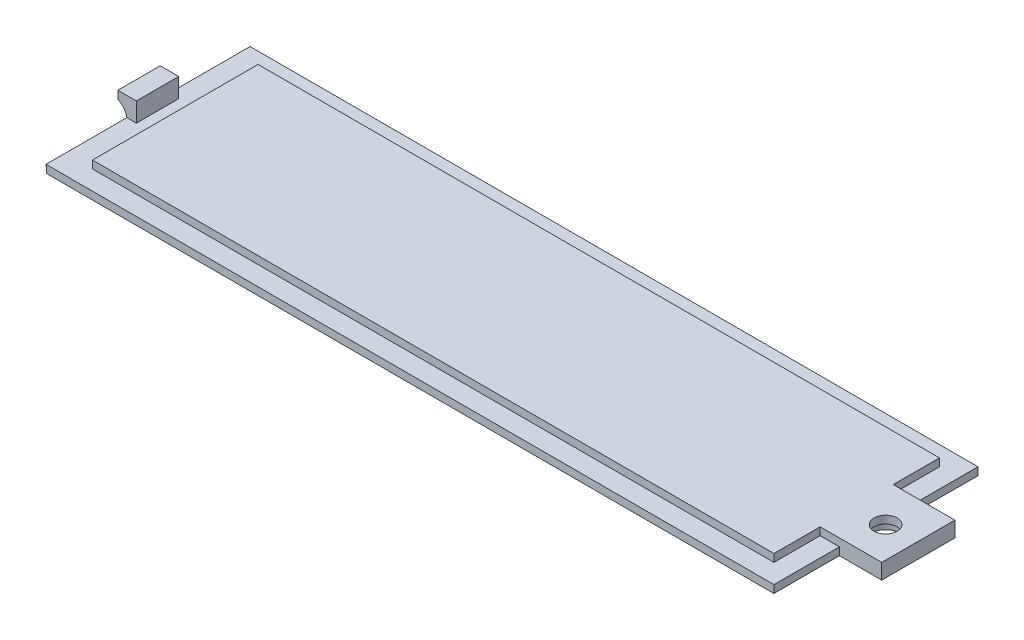
ISO-10303-21;
HEADER;
FILE_DESCRIPTION(('STEP AP214'),'2;1');
FILE_NAME('part.step','',(''),(''),'','','');
FILE_SCHEMA(('AUTOMOTIVE_DESIGN { 1 0 10303 214 1 1 1 1 }'));
ENDSEC;
DATA;
#1=APPLICATION_CONTEXT('core data for automotive mechanical design processes');
#2=APPLICATION_PROTOCOL_DEFINITION('international standard','automotive_design',2000,#1);
#3=PRODUCT_CONTEXT('',#1,'mechanical');
#4=PRODUCT('Part','Part','',(#3));
#5=PRODUCT_RELATED_PRODUCT_CATEGORY('part','',(#4));
#6=PRODUCT_DEFINITION_FORMATION('','',#4);
#7=PRODUCT_DEFINITION_CONTEXT('part definition',#1,'design');
#8=PRODUCT_DEFINITION('design','',#6,#7);
#9=PRODUCT_DEFINITION_SHAPE('','',#8);
#10=(LENGTH_UNIT() NAMED_UNIT(*) SI_UNIT(.MILLI.,.METRE.));
#11=(NAMED_UNIT(*) PLANE_ANGLE_UNIT() SI_UNIT($,.RADIAN.));
#12=(NAMED_UNIT(*) SI_UNIT($,.STERADIAN.) SOLID_ANGLE_UNIT());
#13=UNCERTAINTY_MEASURE_WITH_UNIT(LENGTH_MEASURE(1.E-05),#10,'distance_accuracy_value','');
#14=(GEOMETRIC_REPRESENTATION_CONTEXT(3) GLOBAL_UNCERTAINTY_ASSIGNED_CONTEXT((#13)) GLOBAL_UNIT_ASSIGNED_CONTEXT((#10,
#11,#12)) REPRESENTATION_CONTEXT('',''));
#15=CARTESIAN_POINT('',(0.,0.,0.));
#16=DIRECTION('',(0.,0.,1.));
#17=DIRECTION('',(1.,0.,0.));
#18=AXIS2_PLACEMENT_3D('',#15,#16,#17);
#19=CARTESIAN_POINT('',(0.,1.,0.));
#20=DIRECTION('',(1.,0.,0.));
#21=DIRECTION('',(0.,0.,-1.));
#22=AXIS2_PLACEMENT_3D('',#19,#20,#21);
#23=PLANE('',#22);
#24=DIRECTION('',(0.,-1.,0.));
#25=VECTOR('',#24,1.);
#26=CARTESIAN_POINT('',(0.,1.,0.));
#27=LINE('',#26,#25);
#28=CARTESIAN_POINT('',(0.,0.627210724169584,0.));
#29=VERTEX_POINT('',#28);
#30=CARTESIAN_POINT('',(0.,0.,0.));
#31=VERTEX_POINT('',#30);
#32=EDGE_CURVE('E324',#29,#31,#27,.T.);
#33=ORIENTED_EDGE('',*,*,#32,.F.);
#34=DIRECTION('',(0.,0.,1.));
#35=VECTOR('',#34,1.);
#36=CARTESIAN_POINT('',(0.,0.627210724169584,0.));
#37=LINE('',#36,#35);
#38=CARTESIAN_POINT('',(0.,0.627210724169584,-26.5));
#39=VERTEX_POINT('',#38);
#40=EDGE_CURVE('E326',#29,#39,#37,.F.);
#41=ORIENTED_EDGE('',*,*,#40,.T.);
#42=DIRECTION('',(0.,-1.,0.));
#43=VECTOR('',#42,1.);
#44=CARTESIAN_POINT('',(0.,1.,-26.5));
#45=LINE('',#44,#43);
#46=CARTESIAN_POINT('',(0.,0.,-26.5));
#47=VERTEX_POINT('',#46);
#48=EDGE_CURVE('E288',#39,#47,#45,.T.);
#49=ORIENTED_EDGE('',*,*,#48,.T.);
#50=DIRECTION('',(0.,0.,1.));
#51=VECTOR('',#50,1.);
#52=CARTESIAN_POINT('',(0.,0.,0.));
#53=LINE('',#52,#51);
#54=EDGE_CURVE('E278',#47,#31,#53,.T.);
#55=ORIENTED_EDGE('',*,*,#54,.T.);
#56=EDGE_LOOP('',(#33,#41,#49,#55));
#57=FACE_BOUND('',#56,.T.);
#58=ADVANCED_FACE('F33',(#57),#23,.F.);
#59=CARTESIAN_POINT('',(0.,1.,0.));
#60=DIRECTION('',(0.,-1.,0.));
#61=DIRECTION('',(0.,0.,-1.));
#62=AXIS2_PLACEMENT_3D('',#59,#60,#61);
#63=PLANE('',#62);
#64=DIRECTION('',(-1.,0.,0.));
#65=VECTOR('',#64,1.);
#66=CARTESIAN_POINT('',(100.,1.,-18.));
#67=LINE('',#66,#65);
#68=CARTESIAN_POINT('',(94.5,1.,-18.));
#69=VERTEX_POINT('',#68);
#70=CARTESIAN_POINT('',(92.,1.,-18.));
#71=VERTEX_POINT('',#70);
#72=EDGE_CURVE('E200',#69,#71,#67,.T.);
#73=ORIENTED_EDGE('',*,*,#72,.F.);
#74=DIRECTION('',(0.,0.,-1.));
#75=VECTOR('',#74,1.);
#76=CARTESIAN_POINT('',(94.5,1.,-18.));
#77=LINE('',#76,#75);
#78=CARTESIAN_POINT('',(94.5,1.,-26.5));
#79=VERTEX_POINT('',#78);
#80=EDGE_CURVE('E285',#69,#79,#77,.T.);
#81=ORIENTED_EDGE('',*,*,#80,.T.);
#82=DIRECTION('',(-1.,0.,0.));
#83=VECTOR('',#82,1.);
#84=CARTESIAN_POINT('',(0.,1.,-26.5));
#85=LINE('',#84,#83);
#86=CARTESIAN_POINT('',(-0.0350500882145024,1.,-26.5));
#87=VERTEX_POINT('',#86);
#88=EDGE_CURVE('E54',#79,#87,#85,.T.);
#89=ORIENTED_EDGE('',*,*,#88,.T.);
#90=DIRECTION('',(0.,0.,1.));
#91=VECTOR('',#90,1.);
#92=CARTESIAN_POINT('',(-0.0350500882145024,1.,-26.5));
#93=LINE('',#92,#91);
#94=CARTESIAN_POINT('',(-0.0350500882145024,1.,-16.));
#95=VERTEX_POINT('',#94);
#96=EDGE_CURVE('E41',#87,#95,#93,.T.);
#97=ORIENTED_EDGE('',*,*,#96,.T.);
#98=DIRECTION('',(-1.,0.,0.));
#99=VECTOR('',#98,1.);
#100=CARTESIAN_POINT('',(0.,1.,-16.));
#101=LINE('',#100,#99);
#102=CARTESIAN_POINT('',(1.2,1.,-16.));
#103=VERTEX_POINT('',#102);
#104=EDGE_CURVE('E47',#103,#95,#101,.T.);
#105=ORIENTED_EDGE('',*,*,#104,.F.);
#106=DIRECTION('',(0.,0.,-1.));
#107=VECTOR('',#106,1.);
#108=CARTESIAN_POINT('',(1.2,1.,-16.));
#109=LINE('',#108,#107);
#110=CARTESIAN_POINT('',(1.2,1.,-10.5));
#111=VERTEX_POINT('',#110);
#112=EDGE_CURVE('E228',#111,#103,#109,.T.);
#113=ORIENTED_EDGE('',*,*,#112,.F.);
#114=DIRECTION('',(1.,0.,0.));
#115=VECTOR('',#114,1.);
#116=CARTESIAN_POINT('',(0.,1.,-10.5));
#117=LINE('',#116,#115);
#118=CARTESIAN_POINT('',(-0.0350500882145026,1.,-10.5));
#119=VERTEX_POINT('',#118);
#120=EDGE_CURVE('E218',#119,#111,#117,.T.);
#121=ORIENTED_EDGE('',*,*,#120,.F.);
#122=DIRECTION('',(0.,0.,1.));
#123=VECTOR('',#122,1.);
#124=CARTESIAN_POINT('',(-0.0350500882145026,1.,-10.5));
#125=LINE('',#124,#123);
#126=CARTESIAN_POINT('',(-0.0350500882145024,1.,0.));
#127=VERTEX_POINT('',#126);
#128=EDGE_CURVE('E329',#119,#127,#125,.T.);
#129=ORIENTED_EDGE('',*,*,#128,.T.);
#130=DIRECTION('',(1.,0.,0.));
#131=VECTOR('',#130,1.);
#132=CARTESIAN_POINT('',(0.,1.,0.));
#133=LINE('',#132,#131);
#134=CARTESIAN_POINT('',(94.5,1.,0.));
#135=VERTEX_POINT('',#134);
#136=EDGE_CURVE('E279',#127,#135,#133,.T.);
#137=ORIENTED_EDGE('',*,*,#136,.T.);
#138=DIRECTION('',(0.,0.,-1.));
#139=VECTOR('',#138,1.);
#140=CARTESIAN_POINT('',(94.5,1.,0.));
#141=LINE('',#140,#139);
#142=CARTESIAN_POINT('',(94.5,1.,-8.5));
#143=VERTEX_POINT('',#142);
#144=EDGE_CURVE('E281',#135,#143,#141,.T.);
#145=ORIENTED_EDGE('',*,*,#144,.T.);
#146=DIRECTION('',(1.,0.,0.));
#147=VECTOR('',#146,1.);
#148=CARTESIAN_POINT('',(100.,1.,-8.5));
#149=LINE('',#148,#147);
#150=CARTESIAN_POINT('',(92.,1.,-8.5));
#151=VERTEX_POINT('',#150);
#152=EDGE_CURVE('E205',#151,#143,#149,.T.);
#153=ORIENTED_EDGE('',*,*,#152,.F.);
#154=DIRECTION('',(0.,0.,-1.));
#155=VECTOR('',#154,1.);
#156=CARTESIAN_POINT('',(92.,1.,-24.));
#157=LINE('',#156,#155);
#158=CARTESIAN_POINT('',(92.,1.,-2.5));
#159=VERTEX_POINT('',#158);
#160=EDGE_CURVE('E256',#159,#151,#157,.T.);
#161=ORIENTED_EDGE('',*,*,#160,.F.);
#162=DIRECTION('',(1.,0.,0.));
#163=VECTOR('',#162,1.);
#164=CARTESIAN_POINT('',(3.5,1.,-2.5));
#165=LINE('',#164,#163);
#166=CARTESIAN_POINT('',(3.5,1.,-2.5));
#167=VERTEX_POINT('',#166);
#168=EDGE_CURVE('E252',#167,#159,#165,.T.);
#169=ORIENTED_EDGE('',*,*,#168,.F.);
#170=DIRECTION('',(0.,0.,1.));
#171=VECTOR('',#170,1.);
#172=CARTESIAN_POINT('',(3.5,1.,-24.));
#173=LINE('',#172,#171);
#174=CARTESIAN_POINT('',(3.5,1.,-24.));
#175=VERTEX_POINT('',#174);
#176=EDGE_CURVE('E236',#175,#167,#173,.T.);
#177=ORIENTED_EDGE('',*,*,#176,.F.);
#178=DIRECTION('',(-1.,0.,0.));
#179=VECTOR('',#178,1.);
#180=CARTESIAN_POINT('',(3.5,1.,-24.));
#181=LINE('',#180,#179);
#182=CARTESIAN_POINT('',(92.,1.,-24.));
#183=VERTEX_POINT('',#182);
#184=EDGE_CURVE('E241',#183,#175,#181,.T.);
#185=ORIENTED_EDGE('',*,*,#184,.F.);
#186=EDGE_CURVE('E255',#71,#183,#157,.T.);
#187=ORIENTED_EDGE('',*,*,#186,.F.);
#188=EDGE_LOOP('',(#73,#81,#89,#97,#105,#113,#121,#129,#137,#145,#153,#161,#169,#177,#185,#187));
#189=FACE_BOUND('',#188,.T.);
#190=ADVANCED_FACE('F335',(#189),#63,.F.);
#191=CARTESIAN_POINT('',(92.,2.,-24.));
#192=DIRECTION('',(-1.,0.,0.));
#193=DIRECTION('',(0.,0.,1.));
#194=AXIS2_PLACEMENT_3D('',#191,#192,#193);
#195=PLANE('',#194);
#196=DIRECTION('',(0.,-1.,0.));
#197=VECTOR('',#196,1.);
#198=CARTESIAN_POINT('',(92.,2.,-18.));
#199=LINE('',#198,#197);
#200=CARTESIAN_POINT('',(92.,2.,-18.));
#201=VERTEX_POINT('',#200);
#202=EDGE_CURVE('E215',#201,#71,#199,.T.);
#203=ORIENTED_EDGE('',*,*,#202,.T.);
#204=ORIENTED_EDGE('',*,*,#186,.T.);
#205=DIRECTION('',(0.,-1.,0.));
#206=VECTOR('',#205,1.);
#207=CARTESIAN_POINT('',(92.,2.,-24.));
#208=LINE('',#207,#206);
#209=CARTESIAN_POINT('',(92.,2.,-24.));
#210=VERTEX_POINT('',#209);
#211=EDGE_CURVE('E263',#210,#183,#208,.T.);
#212=ORIENTED_EDGE('',*,*,#211,.F.);
#213=DIRECTION('',(0.,0.,-1.));
#214=VECTOR('',#213,1.);
#215=CARTESIAN_POINT('',(92.,2.,-24.));
#216=LINE('',#215,#214);
#217=EDGE_CURVE('E243',#201,#210,#216,.T.);
#218=ORIENTED_EDGE('',*,*,#217,.F.);
#219=EDGE_LOOP('',(#203,#204,#212,#218));
#220=FACE_BOUND('',#219,.T.);
#221=ADVANCED_FACE('F387',(#220),#195,.F.);
#222=DIRECTION('',(0.,-1.,0.));
#223=VECTOR('',#222,1.);
#224=CARTESIAN_POINT('',(92.,2.,-8.5));
#225=LINE('',#224,#223);
#226=CARTESIAN_POINT('',(92.,2.,-8.5));
#227=VERTEX_POINT('',#226);
#228=EDGE_CURVE('E211',#227,#151,#225,.T.);
#229=ORIENTED_EDGE('',*,*,#228,.F.);
#230=CARTESIAN_POINT('',(92.,2.,-2.5));
#231=VERTEX_POINT('',#230);
#232=EDGE_CURVE('E244',#231,#227,#216,.T.);
#233=ORIENTED_EDGE('',*,*,#232,.F.);
#234=DIRECTION('',(0.,-1.,0.));
#235=VECTOR('',#234,1.);
#236=CARTESIAN_POINT('',(92.,2.,-2.5));
#237=LINE('',#236,#235);
#238=EDGE_CURVE('E266',#231,#159,#237,.T.);
#239=ORIENTED_EDGE('',*,*,#238,.T.);
#240=ORIENTED_EDGE('',*,*,#160,.T.);
#241=EDGE_LOOP('',(#229,#233,#239,#240));
#242=FACE_BOUND('',#241,.T.);
#243=ADVANCED_FACE('F392',(#242),#195,.F.);
#244=CARTESIAN_POINT('',(0.,1.,0.));
#245=DIRECTION('',(0.,0.,-1.));
#246=DIRECTION('',(-1.,0.,0.));
#247=AXIS2_PLACEMENT_3D('',#244,#245,#246);
#248=PLANE('',#247);
#249=DIRECTION('',(1.,0.,0.));
#250=VECTOR('',#249,1.);
#251=CARTESIAN_POINT('',(0.,0.,0.));
#252=LINE('',#251,#250);
#253=CARTESIAN_POINT('',(94.5,0.,0.));
#254=VERTEX_POINT('',#253);
#255=EDGE_CURVE('E291',#31,#254,#252,.T.);
#256=ORIENTED_EDGE('',*,*,#255,.T.);
#257=DIRECTION('',(0.,-1.,0.));
#258=VECTOR('',#257,1.);
#259=CARTESIAN_POINT('',(94.5,1.,0.));
#260=LINE('',#259,#258);
#261=EDGE_CURVE('E321',#135,#254,#260,.T.);
#262=ORIENTED_EDGE('',*,*,#261,.F.);
#263=ORIENTED_EDGE('',*,*,#136,.F.);
#264=CARTESIAN_POINT('',(-2.,0.627210724169584,0.));
#265=DIRECTION('',(0.,0.,-1.));
#266=DIRECTION('',(-1.,0.,0.));
#267=AXIS2_PLACEMENT_3D('',#264,#265,#266);
#268=CIRCLE('',#267,2.);
#269=EDGE_CURVE('E332',#127,#29,#268,.T.);
#270=ORIENTED_EDGE('',*,*,#269,.T.);
#271=ORIENTED_EDGE('',*,*,#32,.T.);
#272=EDGE_LOOP('',(#256,#262,#263,#270,#271));
#273=FACE_BOUND('',#272,.T.);
#274=ADVANCED_FACE('F347',(#273),#248,.F.);
#275=CARTESIAN_POINT('',(94.5,1.,0.));
#276=DIRECTION('',(-1.,0.,0.));
#277=DIRECTION('',(0.,0.,1.));
#278=AXIS2_PLACEMENT_3D('',#275,#276,#277);
#279=PLANE('',#278);
#280=DIRECTION('',(0.,0.,-1.));
#281=VECTOR('',#280,1.);
#282=CARTESIAN_POINT('',(94.5,0.,0.));
#283=LINE('',#282,#281);
#284=CARTESIAN_POINT('',(94.5,0.,-8.5));
#285=VERTEX_POINT('',#284);
#286=EDGE_CURVE('E293',#254,#285,#283,.T.);
#287=ORIENTED_EDGE('',*,*,#286,.T.);
#288=DIRECTION('',(0.,-1.,0.));
#289=VECTOR('',#288,1.);
#290=CARTESIAN_POINT('',(94.5,1.,-8.5));
#291=LINE('',#290,#289);
#292=EDGE_CURVE('E318',#143,#285,#291,.T.);
#293=ORIENTED_EDGE('',*,*,#292,.F.);
#294=ORIENTED_EDGE('',*,*,#144,.F.);
#295=ORIENTED_EDGE('',*,*,#261,.T.);
#296=EDGE_LOOP('',(#287,#293,#294,#295));
#297=FACE_BOUND('',#296,.T.);
#298=ADVANCED_FACE('F356',(#297),#279,.F.);
#299=CARTESIAN_POINT('',(100.,1.,-8.5));
#300=DIRECTION('',(0.,0.,-1.));
#301=DIRECTION('',(-1.,0.,0.));
#302=AXIS2_PLACEMENT_3D('',#299,#300,#301);
#303=PLANE('',#302);
#304=DIRECTION('',(1.,0.,0.));
#305=VECTOR('',#304,1.);
#306=CARTESIAN_POINT('',(100.,0.,-8.5));
#307=LINE('',#306,#305);
#308=CARTESIAN_POINT('',(100.,0.,-8.5));
#309=VERTEX_POINT('',#308);
#310=EDGE_CURVE('E295',#285,#309,#307,.T.);
#311=ORIENTED_EDGE('',*,*,#310,.T.);
#312=DIRECTION('',(0.,-1.,0.));
#313=VECTOR('',#312,1.);
#314=CARTESIAN_POINT('',(100.,1.,-8.5));
#315=LINE('',#314,#313);
#316=CARTESIAN_POINT('',(100.,2.,-8.5));
#317=VERTEX_POINT('',#316);
#318=EDGE_CURVE('E315',#317,#309,#315,.T.);
#319=ORIENTED_EDGE('',*,*,#318,.F.);
#320=DIRECTION('',(1.,0.,0.));
#321=VECTOR('',#320,1.);
#322=CARTESIAN_POINT('',(100.,2.,-8.5));
#323=LINE('',#322,#321);
#324=EDGE_CURVE('E208',#227,#317,#323,.T.);
#325=ORIENTED_EDGE('',*,*,#324,.F.);
#326=ORIENTED_EDGE('',*,*,#228,.T.);
#327=ORIENTED_EDGE('',*,*,#152,.T.);
#328=ORIENTED_EDGE('',*,*,#292,.T.);
#329=EDGE_LOOP('',(#311,#319,#325,#326,#327,#328));
#330=FACE_BOUND('',#329,.T.);
#331=ADVANCED_FACE('F359',(#330),#303,.F.);
#332=CARTESIAN_POINT('',(100.,1.,-18.));
#333=DIRECTION('',(-1.,0.,0.));
#334=DIRECTION('',(0.,0.,1.));
#335=AXIS2_PLACEMENT_3D('',#332,#333,#334);
#336=PLANE('',#335);
#337=DIRECTION('',(0.,0.,-1.));
#338=VECTOR('',#337,1.);
#339=CARTESIAN_POINT('',(100.,0.,-18.));
#340=LINE('',#339,#338);
#341=CARTESIAN_POINT('',(100.,0.,-18.));
#342=VERTEX_POINT('',#341);
#343=EDGE_CURVE('E297',#309,#342,#340,.T.);
#344=ORIENTED_EDGE('',*,*,#343,.T.);
#345=DIRECTION('',(0.,-1.,0.));
#346=VECTOR('',#345,1.);
#347=CARTESIAN_POINT('',(100.,1.,-18.));
#348=LINE('',#347,#346);
#349=CARTESIAN_POINT('',(100.,2.,-18.));
#350=VERTEX_POINT('',#349);
#351=EDGE_CURVE('E312',#350,#342,#348,.T.);
#352=ORIENTED_EDGE('',*,*,#351,.F.);
#353=DIRECTION('',(0.,0.,-1.));
#354=VECTOR('',#353,1.);
#355=CARTESIAN_POINT('',(100.,2.,-8.5));
#356=LINE('',#355,#354);
#357=EDGE_CURVE('E201',#317,#350,#356,.T.);
#358=ORIENTED_EDGE('',*,*,#357,.F.);
#359=ORIENTED_EDGE('',*,*,#318,.T.);
#360=EDGE_LOOP('',(#344,#352,#358,#359));
#361=FACE_BOUND('',#360,.T.);
#362=ADVANCED_FACE('F397',(#361),#336,.F.);
#363=CARTESIAN_POINT('',(94.5,1.,-18.));
#364=DIRECTION('',(0.,0.,1.));
#365=DIRECTION('',(1.,0.,0.));
#366=AXIS2_PLACEMENT_3D('',#363,#364,#365);
#367=PLANE('',#366);
#368=DIRECTION('',(-1.,0.,0.));
#369=VECTOR('',#368,1.);
#370=CARTESIAN_POINT('',(94.5,0.,-18.));
#371=LINE('',#370,#369);
#372=CARTESIAN_POINT('',(94.5,0.,-18.));
#373=VERTEX_POINT('',#372);
#374=EDGE_CURVE('E299',#342,#373,#371,.T.);
#375=ORIENTED_EDGE('',*,*,#374,.T.);
#376=DIRECTION('',(0.,-1.,0.));
#377=VECTOR('',#376,1.);
#378=CARTESIAN_POINT('',(94.5,1.,-18.));
#379=LINE('',#378,#377);
#380=EDGE_CURVE('E309',#69,#373,#379,.T.);
#381=ORIENTED_EDGE('',*,*,#380,.F.);
#382=ORIENTED_EDGE('',*,*,#72,.T.);
#383=ORIENTED_EDGE('',*,*,#202,.F.);
#384=DIRECTION('',(-1.,0.,0.));
#385=VECTOR('',#384,1.);
#386=CARTESIAN_POINT('',(100.,2.,-18.));
#387=LINE('',#386,#385);
#388=EDGE_CURVE('E204',#350,#201,#387,.T.);
#389=ORIENTED_EDGE('',*,*,#388,.F.);
#390=ORIENTED_EDGE('',*,*,#351,.T.);
#391=EDGE_LOOP('',(#375,#381,#382,#383,#389,#390));
#392=FACE_BOUND('',#391,.T.);
#393=ADVANCED_FACE('F400',(#392),#367,.F.);
#394=CARTESIAN_POINT('',(94.5,1.,-18.));
#395=DIRECTION('',(-1.,0.,0.));
#396=DIRECTION('',(0.,0.,1.));
#397=AXIS2_PLACEMENT_3D('',#394,#395,#396);
#398=PLANE('',#397);
#399=DIRECTION('',(0.,0.,-1.));
#400=VECTOR('',#399,1.);
#401=CARTESIAN_POINT('',(94.5,0.,-18.));
#402=LINE('',#401,#400);
#403=CARTESIAN_POINT('',(94.5,0.,-26.5));
#404=VERTEX_POINT('',#403);
#405=EDGE_CURVE('E301',#373,#404,#402,.T.);
#406=ORIENTED_EDGE('',*,*,#405,.T.);
#407=DIRECTION('',(0.,-1.,0.));
#408=VECTOR('',#407,1.);
#409=CARTESIAN_POINT('',(94.5,1.,-26.5));
#410=LINE('',#409,#408);
#411=EDGE_CURVE('E306',#79,#404,#410,.T.);
#412=ORIENTED_EDGE('',*,*,#411,.F.);
#413=ORIENTED_EDGE('',*,*,#80,.F.);
#414=ORIENTED_EDGE('',*,*,#380,.T.);
#415=EDGE_LOOP('',(#406,#412,#413,#414));
#416=FACE_BOUND('',#415,.T.);
#417=ADVANCED_FACE('F404',(#416),#398,.F.);
#418=CARTESIAN_POINT('',(0.,1.,-26.5));
#419=DIRECTION('',(0.,0.,1.));
#420=DIRECTION('',(1.,0.,0.));
#421=AXIS2_PLACEMENT_3D('',#418,#419,#420);
#422=PLANE('',#421);
#423=DIRECTION('',(-1.,0.,0.));
#424=VECTOR('',#423,1.);
#425=CARTESIAN_POINT('',(0.,0.,-26.5));
#426=LINE('',#425,#424);
#427=EDGE_CURVE('E282',#404,#47,#426,.T.);
#428=ORIENTED_EDGE('',*,*,#427,.T.);
#429=ORIENTED_EDGE('',*,*,#48,.F.);
#430=CARTESIAN_POINT('',(-2.,0.627210724169584,-26.5));
#431=DIRECTION('',(0.,0.,1.));
#432=DIRECTION('',(1.,0.,0.));
#433=AXIS2_PLACEMENT_3D('',#430,#431,#432);
#434=CIRCLE('',#433,2.);
#435=EDGE_CURVE('E334',#39,#87,#434,.T.);
#436=ORIENTED_EDGE('',*,*,#435,.T.);
#437=ORIENTED_EDGE('',*,*,#88,.F.);
#438=ORIENTED_EDGE('',*,*,#411,.T.);
#439=EDGE_LOOP('',(#428,#429,#436,#437,#438));
#440=FACE_BOUND('',#439,.T.);
#441=ADVANCED_FACE('F340',(#440),#422,.F.);
#442=CARTESIAN_POINT('',(0.,0.,0.));
#443=DIRECTION('',(0.,-1.,0.));
#444=DIRECTION('',(0.,0.,-1.));
#445=AXIS2_PLACEMENT_3D('',#442,#443,#444);
#446=PLANE('',#445);
#447=CARTESIAN_POINT('',(96.,0.,-13.));
#448=DIRECTION('',(0.,1.,0.));
#449=DIRECTION('',(0.,0.,1.));
#450=AXIS2_PLACEMENT_3D('',#447,#448,#449);
#451=CIRCLE('',#450,2.);
#452=CARTESIAN_POINT('',(96.,0.,-11.));
#453=VERTEX_POINT('',#452);
#454=EDGE_CURVE('E272',#453,#453,#451,.T.);
#455=ORIENTED_EDGE('',*,*,#454,.T.);
#456=EDGE_LOOP('',(#455));
#457=FACE_BOUND('',#456,.T.);
#458=ORIENTED_EDGE('',*,*,#54,.F.);
#459=ORIENTED_EDGE('',*,*,#427,.F.);
#460=ORIENTED_EDGE('',*,*,#405,.F.);
#461=ORIENTED_EDGE('',*,*,#374,.F.);
#462=ORIENTED_EDGE('',*,*,#343,.F.);
#463=ORIENTED_EDGE('',*,*,#310,.F.);
#464=ORIENTED_EDGE('',*,*,#286,.F.);
#465=ORIENTED_EDGE('',*,*,#255,.F.);
#466=EDGE_LOOP('',(#458,#459,#460,#461,#462,#463,#464,#465));
#467=FACE_BOUND('',#466,.T.);
#468=ADVANCED_FACE('F351',(#457,#467),#446,.T.);
#469=CARTESIAN_POINT('',(96.,0.,-13.));
#470=DIRECTION('',(0.,1.,0.));
#471=DIRECTION('',(0.,0.,1.));
#472=AXIS2_PLACEMENT_3D('',#469,#470,#471);
#473=CYLINDRICAL_SURFACE('',#472,2.);
#474=ORIENTED_EDGE('',*,*,#454,.F.);
#475=EDGE_LOOP('',(#474));
#476=FACE_BOUND('',#475,.T.);
#477=CARTESIAN_POINT('',(96.,1.,-13.));
#478=DIRECTION('',(0.,-1.,0.));
#479=DIRECTION('',(0.,0.,-1.));
#480=AXIS2_PLACEMENT_3D('',#477,#478,#479);
#481=CIRCLE('',#480,2.);
#482=CARTESIAN_POINT('',(96.,1.,-15.));
#483=VERTEX_POINT('',#482);
#484=EDGE_CURVE('E275',#483,#483,#481,.T.);
#485=ORIENTED_EDGE('',*,*,#484,.F.);
#486=EDGE_LOOP('',(#485));
#487=FACE_BOUND('',#486,.T.);
#488=ADVANCED_FACE('F412',(#476,#487),#473,.F.);
#489=CARTESIAN_POINT('',(3.5,2.,-24.));
#490=DIRECTION('',(1.,0.,0.));
#491=DIRECTION('',(0.,0.,-1.));
#492=AXIS2_PLACEMENT_3D('',#489,#490,#491);
#493=PLANE('',#492);
#494=ORIENTED_EDGE('',*,*,#176,.T.);
#495=DIRECTION('',(0.,-1.,0.));
#496=VECTOR('',#495,1.);
#497=CARTESIAN_POINT('',(3.5,2.,-2.5));
#498=LINE('',#497,#496);
#499=CARTESIAN_POINT('',(3.5,2.,-2.5));
#500=VERTEX_POINT('',#499);
#501=EDGE_CURVE('E269',#500,#167,#498,.T.);
#502=ORIENTED_EDGE('',*,*,#501,.F.);
#503=DIRECTION('',(0.,0.,1.));
#504=VECTOR('',#503,1.);
#505=CARTESIAN_POINT('',(3.5,2.,-24.));
#506=LINE('',#505,#504);
#507=CARTESIAN_POINT('',(3.5,2.,-24.));
#508=VERTEX_POINT('',#507);
#509=EDGE_CURVE('E237',#508,#500,#506,.T.);
#510=ORIENTED_EDGE('',*,*,#509,.F.);
#511=DIRECTION('',(0.,-1.,0.));
#512=VECTOR('',#511,1.);
#513=CARTESIAN_POINT('',(3.5,2.,-24.));
#514=LINE('',#513,#512);
#515=EDGE_CURVE('E249',#508,#175,#514,.T.);
#516=ORIENTED_EDGE('',*,*,#515,.T.);
#517=EDGE_LOOP('',(#494,#502,#510,#516));
#518=FACE_BOUND('',#517,.T.);
#519=ADVANCED_FACE('F417',(#518),#493,.F.);
#520=CARTESIAN_POINT('',(3.5,2.,-2.5));
#521=DIRECTION('',(0.,0.,-1.));
#522=DIRECTION('',(-1.,0.,0.));
#523=AXIS2_PLACEMENT_3D('',#520,#521,#522);
#524=PLANE('',#523);
#525=ORIENTED_EDGE('',*,*,#168,.T.);
#526=ORIENTED_EDGE('',*,*,#238,.F.);
#527=DIRECTION('',(1.,0.,0.));
#528=VECTOR('',#527,1.);
#529=CARTESIAN_POINT('',(3.5,2.,-2.5));
#530=LINE('',#529,#528);
#531=EDGE_CURVE('E240',#500,#231,#530,.T.);
#532=ORIENTED_EDGE('',*,*,#531,.F.);
#533=ORIENTED_EDGE('',*,*,#501,.T.);
#534=EDGE_LOOP('',(#525,#526,#532,#533));
#535=FACE_BOUND('',#534,.T.);
#536=ADVANCED_FACE('F421',(#535),#524,.F.);
#537=CARTESIAN_POINT('',(3.5,2.,-24.));
#538=DIRECTION('',(0.,0.,1.));
#539=DIRECTION('',(1.,0.,0.));
#540=AXIS2_PLACEMENT_3D('',#537,#538,#539);
#541=PLANE('',#540);
#542=ORIENTED_EDGE('',*,*,#184,.T.);
#543=ORIENTED_EDGE('',*,*,#515,.F.);
#544=DIRECTION('',(-1.,0.,0.));
#545=VECTOR('',#544,1.);
#546=CARTESIAN_POINT('',(3.5,2.,-24.));
#547=LINE('',#546,#545);
#548=EDGE_CURVE('E247',#210,#508,#547,.T.);
#549=ORIENTED_EDGE('',*,*,#548,.F.);
#550=ORIENTED_EDGE('',*,*,#211,.T.);
#551=EDGE_LOOP('',(#542,#543,#549,#550));
#552=FACE_BOUND('',#551,.T.);
#553=ADVANCED_FACE('F425',(#552),#541,.F.);
#554=CARTESIAN_POINT('',(0.,2.,0.));
#555=DIRECTION('',(0.,1.,0.));
#556=DIRECTION('',(0.,0.,1.));
#557=AXIS2_PLACEMENT_3D('',#554,#555,#556);
#558=PLANE('',#557);
#559=CARTESIAN_POINT('',(96.,2.,-13.));
#560=DIRECTION('',(0.,1.,0.));
#561=DIRECTION('',(0.,0.,1.));
#562=AXIS2_PLACEMENT_3D('',#559,#560,#561);
#563=CIRCLE('',#562,1.5);
#564=CARTESIAN_POINT('',(96.,2.,-11.5));
#565=VERTEX_POINT('',#564);
#566=EDGE_CURVE('E197',#565,#565,#563,.T.);
#567=ORIENTED_EDGE('',*,*,#566,.F.);
#568=EDGE_LOOP('',(#567));
#569=FACE_BOUND('',#568,.T.);
#570=ORIENTED_EDGE('',*,*,#509,.T.);
#571=ORIENTED_EDGE('',*,*,#531,.T.);
#572=ORIENTED_EDGE('',*,*,#232,.T.);
#573=ORIENTED_EDGE('',*,*,#324,.T.);
#574=ORIENTED_EDGE('',*,*,#357,.T.);
#575=ORIENTED_EDGE('',*,*,#388,.T.);
#576=ORIENTED_EDGE('',*,*,#217,.T.);
#577=ORIENTED_EDGE('',*,*,#548,.T.);
#578=EDGE_LOOP('',(#570,#571,#572,#573,#574,#575,#576,#577));
#579=FACE_BOUND('',#578,.T.);
#580=ADVANCED_FACE('F380',(#569,#579),#558,.T.);
#581=CARTESIAN_POINT('',(0.,3.5,-10.5));
#582=DIRECTION('',(0.,0.,-1.));
#583=DIRECTION('',(-1.,0.,0.));
#584=AXIS2_PLACEMENT_3D('',#581,#582,#583);
#585=PLANE('',#584);
#586=ORIENTED_EDGE('',*,*,#120,.T.);
#587=DIRECTION('',(0.,-1.,0.));
#588=VECTOR('',#587,1.);
#589=CARTESIAN_POINT('',(1.2,3.5,-10.5));
#590=LINE('',#589,#588);
#591=CARTESIAN_POINT('',(1.2,3.5,-10.5));
#592=VERTEX_POINT('',#591);
#593=EDGE_CURVE('E233',#592,#111,#590,.T.);
#594=ORIENTED_EDGE('',*,*,#593,.F.);
#595=DIRECTION('',(1.,0.,0.));
#596=VECTOR('',#595,1.);
#597=CARTESIAN_POINT('',(0.,3.5,-10.5));
#598=LINE('',#597,#596);
#599=CARTESIAN_POINT('',(-1.2,3.5,-10.5));
#600=VERTEX_POINT('',#599);
#601=EDGE_CURVE('E219',#600,#592,#598,.T.);
#602=ORIENTED_EDGE('',*,*,#601,.F.);
#603=DIRECTION('',(0.,1.,0.));
#604=VECTOR('',#603,1.);
#605=CARTESIAN_POINT('',(-1.2,3.5,-10.5));
#606=LINE('',#605,#604);
#607=CARTESIAN_POINT('',(-1.2,2.46024100215192,-10.5));
#608=VERTEX_POINT('',#607);
#609=EDGE_CURVE('E189',#608,#600,#606,.T.);
#610=ORIENTED_EDGE('',*,*,#609,.F.);
#611=CARTESIAN_POINT('',(-2.,0.627210724169584,-10.5));
#612=DIRECTION('',(0.,0.,-1.));
#613=DIRECTION('',(-1.,0.,0.));
#614=AXIS2_PLACEMENT_3D('',#611,#612,#613);
#615=CIRCLE('',#614,2.);
#616=EDGE_CURVE('E188',#608,#119,#615,.T.);
#617=ORIENTED_EDGE('',*,*,#616,.T.);
#618=EDGE_LOOP('',(#586,#594,#602,#610,#617));
#619=FACE_BOUND('',#618,.T.);
#620=ADVANCED_FACE('F364',(#619),#585,.F.);
#621=CARTESIAN_POINT('',(1.2,3.5,-16.));
#622=DIRECTION('',(-1.,0.,0.));
#623=DIRECTION('',(0.,0.,1.));
#624=AXIS2_PLACEMENT_3D('',#621,#622,#623);
#625=PLANE('',#624);
#626=ORIENTED_EDGE('',*,*,#112,.T.);
#627=DIRECTION('',(0.,-1.,0.));
#628=VECTOR('',#627,1.);
#629=CARTESIAN_POINT('',(1.2,3.5,-16.));
#630=LINE('',#629,#628);
#631=CARTESIAN_POINT('',(1.2,3.5,-16.));
#632=VERTEX_POINT('',#631);
#633=EDGE_CURVE('E225',#632,#103,#630,.T.);
#634=ORIENTED_EDGE('',*,*,#633,.F.);
#635=DIRECTION('',(0.,0.,-1.));
#636=VECTOR('',#635,1.);
#637=CARTESIAN_POINT('',(1.2,3.5,-16.));
#638=LINE('',#637,#636);
#639=EDGE_CURVE('E221',#592,#632,#638,.T.);
#640=ORIENTED_EDGE('',*,*,#639,.F.);
#641=ORIENTED_EDGE('',*,*,#593,.T.);
#642=EDGE_LOOP('',(#626,#634,#640,#641));
#643=FACE_BOUND('',#642,.T.);
#644=ADVANCED_FACE('F370',(#643),#625,.F.);
#645=CARTESIAN_POINT('',(0.,3.5,-16.));
#646=DIRECTION('',(0.,0.,1.));
#647=DIRECTION('',(1.,0.,0.));
#648=AXIS2_PLACEMENT_3D('',#645,#646,#647);
#649=PLANE('',#648);
#650=ORIENTED_EDGE('',*,*,#104,.T.);
#651=CARTESIAN_POINT('',(-2.,0.627210724169584,-16.));
#652=DIRECTION('',(0.,0.,1.));
#653=DIRECTION('',(1.,0.,0.));
#654=AXIS2_PLACEMENT_3D('',#651,#652,#653);
#655=CIRCLE('',#654,2.);
#656=CARTESIAN_POINT('',(-1.2,2.46024100215192,-16.));
#657=VERTEX_POINT('',#656);
#658=EDGE_CURVE('E11',#95,#657,#655,.T.);
#659=ORIENTED_EDGE('',*,*,#658,.T.);
#660=DIRECTION('',(0.,-1.,0.));
#661=VECTOR('',#660,1.);
#662=CARTESIAN_POINT('',(-1.2,3.5,-16.));
#663=LINE('',#662,#661);
#664=CARTESIAN_POINT('',(-1.2,3.5,-16.));
#665=VERTEX_POINT('',#664);
#666=EDGE_CURVE('E171',#665,#657,#663,.T.);
#667=ORIENTED_EDGE('',*,*,#666,.F.);
#668=DIRECTION('',(-1.,0.,0.));
#669=VECTOR('',#668,1.);
#670=CARTESIAN_POINT('',(0.,3.5,-16.));
#671=LINE('',#670,#669);
#672=EDGE_CURVE('E223',#632,#665,#671,.T.);
#673=ORIENTED_EDGE('',*,*,#672,.F.);
#674=ORIENTED_EDGE('',*,*,#633,.T.);
#675=EDGE_LOOP('',(#650,#659,#667,#673,#674));
#676=FACE_BOUND('',#675,.T.);
#677=ADVANCED_FACE('F169',(#676),#649,.F.);
#678=CARTESIAN_POINT('',(0.,3.5,0.));
#679=DIRECTION('',(0.,1.,0.));
#680=DIRECTION('',(0.,0.,1.));
#681=AXIS2_PLACEMENT_3D('',#678,#679,#680);
#682=PLANE('',#681);
#683=ORIENTED_EDGE('',*,*,#672,.T.);
#684=DIRECTION('',(0.,0.,-1.));
#685=VECTOR('',#684,1.);
#686=CARTESIAN_POINT('',(-1.2,3.5,-16.));
#687=LINE('',#686,#685);
#688=EDGE_CURVE('E183',#600,#665,#687,.T.);
#689=ORIENTED_EDGE('',*,*,#688,.F.);
#690=ORIENTED_EDGE('',*,*,#601,.T.);
#691=ORIENTED_EDGE('',*,*,#639,.T.);
#692=EDGE_LOOP('',(#683,#689,#690,#691));
#693=FACE_BOUND('',#692,.T.);
#694=ADVANCED_FACE('F366',(#693),#682,.T.);
#695=CARTESIAN_POINT('',(0.,1.,0.));
#696=DIRECTION('',(0.,1.,0.));
#697=DIRECTION('',(0.,0.,1.));
#698=AXIS2_PLACEMENT_3D('',#695,#696,#697);
#699=PLANE('',#698);
#700=CARTESIAN_POINT('',(96.,1.,-13.));
#701=DIRECTION('',(0.,-1.,0.));
#702=DIRECTION('',(0.,0.,-1.));
#703=AXIS2_PLACEMENT_3D('',#700,#701,#702);
#704=CIRCLE('',#703,1.5);
#705=CARTESIAN_POINT('',(96.,1.,-14.5));
#706=VERTEX_POINT('',#705);
#707=EDGE_CURVE('E194',#706,#706,#704,.T.);
#708=ORIENTED_EDGE('',*,*,#707,.F.);
#709=EDGE_LOOP('',(#708));
#710=FACE_BOUND('',#709,.T.);
#711=ORIENTED_EDGE('',*,*,#484,.T.);
#712=EDGE_LOOP('',(#711));
#713=FACE_BOUND('',#712,.T.);
#714=ADVANCED_FACE('F560',(#710,#713),#699,.F.);
#715=CARTESIAN_POINT('',(96.,4.,-13.));
#716=DIRECTION('',(0.,-1.,0.));
#717=DIRECTION('',(0.,0.,-1.));
#718=AXIS2_PLACEMENT_3D('',#715,#716,#717);
#719=CYLINDRICAL_SURFACE('',#718,1.5);
#720=ORIENTED_EDGE('',*,*,#566,.T.);
#721=EDGE_LOOP('',(#720));
#722=FACE_BOUND('',#721,.T.);
#723=ORIENTED_EDGE('',*,*,#707,.T.);
#724=EDGE_LOOP('',(#723));
#725=FACE_BOUND('',#724,.T.);
#726=ADVANCED_FACE('F564',(#722,#725),#719,.F.);
#727=CARTESIAN_POINT('',(-1.2,0.,0.));
#728=DIRECTION('',(-1.,0.,0.));
#729=DIRECTION('',(0.,0.,1.));
#730=AXIS2_PLACEMENT_3D('',#727,#728,#729);
#731=PLANE('',#730);
#732=ORIENTED_EDGE('',*,*,#666,.T.);
#733=DIRECTION('',(0.,0.,1.));
#734=VECTOR('',#733,1.);
#735=CARTESIAN_POINT('',(-1.2,2.46024100215192,-16.));
#736=LINE('',#735,#734);
#737=EDGE_CURVE('E180',#657,#608,#736,.T.);
#738=ORIENTED_EDGE('',*,*,#737,.T.);
#739=ORIENTED_EDGE('',*,*,#609,.T.);
#740=ORIENTED_EDGE('',*,*,#688,.T.);
#741=EDGE_LOOP('',(#732,#738,#739,#740));
#742=FACE_BOUND('',#741,.T.);
#743=ADVANCED_FACE('F178',(#742),#731,.T.);
#744=CARTESIAN_POINT('',(-2.,0.627210724169584,-16.));
#745=DIRECTION('',(0.,0.,1.));
#746=DIRECTION('',(1.,0.,0.));
#747=AXIS2_PLACEMENT_3D('',#744,#745,#746);
#748=CYLINDRICAL_SURFACE('',#747,2.);
#749=ORIENTED_EDGE('',*,*,#435,.F.);
#750=ORIENTED_EDGE('',*,*,#40,.F.);
#751=ORIENTED_EDGE('',*,*,#269,.F.);
#752=ORIENTED_EDGE('',*,*,#128,.F.);
#753=ORIENTED_EDGE('',*,*,#616,.F.);
#754=ORIENTED_EDGE('',*,*,#737,.F.);
#755=ORIENTED_EDGE('',*,*,#658,.F.);
#756=ORIENTED_EDGE('',*,*,#96,.F.);
#757=EDGE_LOOP('',(#749,#750,#751,#752,#753,#754,#755,#756));
#758=FACE_BOUND('',#757,.T.);
#759=ADVANCED_FACE('F35',(#758),#748,.F.);
#760=CLOSED_SHELL('',(#58,#190,#221,#243,#274,#298,#331,#362,#393,#417,#441,#468,#488,#519,#536,
#553,#580,#620,#644,#677,#694,#714,#726,#743,#759));
#761=MANIFOLD_SOLID_BREP('B2',#760);
#762=ADVANCED_BREP_SHAPE_REPRESENTATION('',(#18,#761),#14);
#763=SHAPE_DEFINITION_REPRESENTATION(#9,#762);
ENDSEC;
END-ISO-10303-21;
